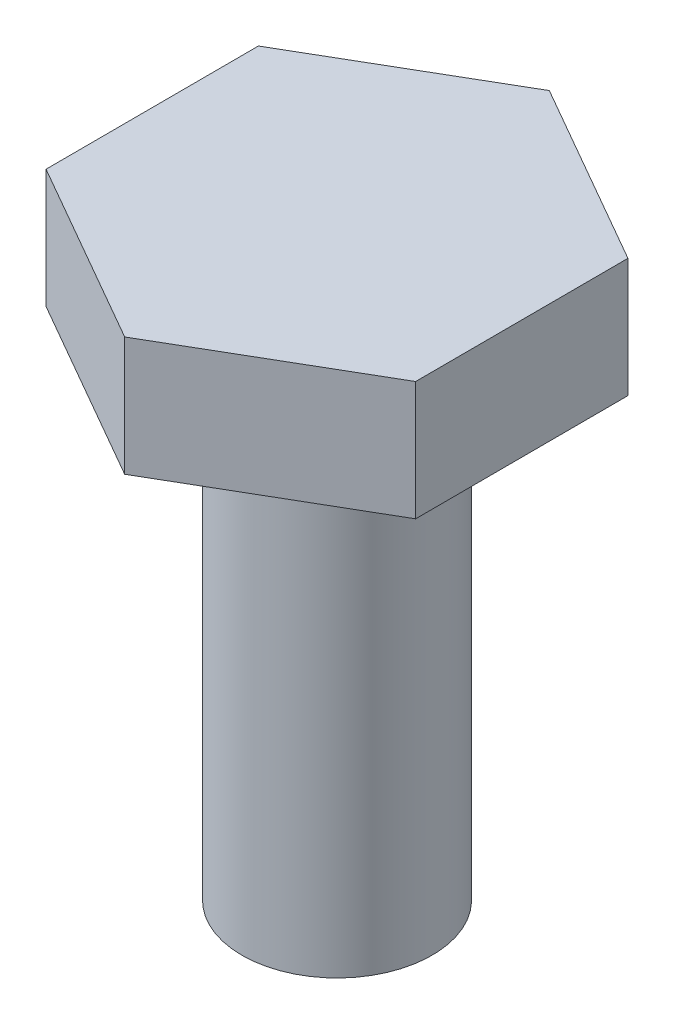
ISO-10303-21;
HEADER;
FILE_DESCRIPTION(('STEP AP214'),'2;1');
FILE_NAME('part.step','',(''),(''),'','','');
FILE_SCHEMA(('AUTOMOTIVE_DESIGN { 1 0 10303 214 1 1 1 1 }'));
ENDSEC;
DATA;
#1=APPLICATION_CONTEXT('core data for automotive mechanical design processes');
#2=APPLICATION_PROTOCOL_DEFINITION('international standard','automotive_design',2000,#1);
#3=PRODUCT_CONTEXT('',#1,'mechanical');
#4=PRODUCT('Part','Part','',(#3));
#5=PRODUCT_RELATED_PRODUCT_CATEGORY('part','',(#4));
#6=PRODUCT_DEFINITION_FORMATION('','',#4);
#7=PRODUCT_DEFINITION_CONTEXT('part definition',#1,'design');
#8=PRODUCT_DEFINITION('design','',#6,#7);
#9=PRODUCT_DEFINITION_SHAPE('','',#8);
#10=(LENGTH_UNIT() NAMED_UNIT(*) SI_UNIT(.MILLI.,.METRE.));
#11=(NAMED_UNIT(*) PLANE_ANGLE_UNIT() SI_UNIT($,.RADIAN.));
#12=(NAMED_UNIT(*) SI_UNIT($,.STERADIAN.) SOLID_ANGLE_UNIT());
#13=UNCERTAINTY_MEASURE_WITH_UNIT(LENGTH_MEASURE(1.E-05),#10,'distance_accuracy_value','');
#14=(GEOMETRIC_REPRESENTATION_CONTEXT(3) GLOBAL_UNCERTAINTY_ASSIGNED_CONTEXT((#13)) GLOBAL_UNIT_ASSIGNED_CONTEXT((#10,
#11,#12)) REPRESENTATION_CONTEXT('',''));
#15=CARTESIAN_POINT('',(0.,0.,0.));
#16=DIRECTION('',(0.,0.,1.));
#17=DIRECTION('',(1.,0.,0.));
#18=AXIS2_PLACEMENT_3D('',#15,#16,#17);
#19=CARTESIAN_POINT('',(0.,4.,0.));
#20=DIRECTION('',(0.,-1.,0.));
#21=DIRECTION('',(0.,0.,-1.));
#22=AXIS2_PLACEMENT_3D('',#19,#20,#21);
#23=CYLINDRICAL_SURFACE('',#22,0.8);
#24=CARTESIAN_POINT('',(0.,4.,0.));
#25=DIRECTION('',(0.,1.,0.));
#26=DIRECTION('',(0.,0.,1.));
#27=AXIS2_PLACEMENT_3D('',#24,#25,#26);
#28=CIRCLE('',#27,0.8);
#29=CARTESIAN_POINT('',(0.,4.,0.8));
#30=VERTEX_POINT('',#29);
#31=EDGE_CURVE('E11',#30,#30,#28,.T.);
#32=ORIENTED_EDGE('',*,*,#31,.F.);
#33=EDGE_LOOP('',(#32));
#34=FACE_BOUND('',#33,.T.);
#35=CARTESIAN_POINT('',(0.,0.,0.));
#36=DIRECTION('',(0.,1.,0.));
#37=DIRECTION('',(0.,0.,1.));
#38=AXIS2_PLACEMENT_3D('',#35,#36,#37);
#39=CIRCLE('',#38,0.8);
#40=CARTESIAN_POINT('',(0.,0.,0.8));
#41=VERTEX_POINT('',#40);
#42=EDGE_CURVE('E37',#41,#41,#39,.T.);
#43=ORIENTED_EDGE('',*,*,#42,.T.);
#44=EDGE_LOOP('',(#43));
#45=FACE_BOUND('',#44,.T.);
#46=ADVANCED_FACE('F34',(#34,#45),#23,.T.);
#47=CARTESIAN_POINT('',(0.,0.,0.));
#48=DIRECTION('',(0.,1.,0.));
#49=DIRECTION('',(0.,0.,1.));
#50=AXIS2_PLACEMENT_3D('',#47,#48,#49);
#51=PLANE('',#50);
#52=ORIENTED_EDGE('',*,*,#42,.F.);
#53=EDGE_LOOP('',(#52));
#54=FACE_BOUND('',#53,.T.);
#55=ADVANCED_FACE('F142',(#54),#51,.F.);
#56=CARTESIAN_POINT('',(1.54774323390104,5.,-0.898790417865524));
#57=DIRECTION('',(-0.497819198807092,0.,0.867280834158731));
#58=DIRECTION('',(0.867280834158731,0.,0.497819198807092));
#59=AXIS2_PLACEMENT_3D('',#56,#57,#58);
#60=PLANE('',#59);
#61=DIRECTION('',(-0.867280834158731,0.,-0.497819198807092));
#62=VECTOR('',#61,1.);
#63=CARTESIAN_POINT('',(1.54774323390104,4.,-0.898790417865524));
#64=LINE('',#63,#62);
#65=CARTESIAN_POINT('',(1.54774323390104,4.,-0.898790417865524));
#66=VERTEX_POINT('',#65);
#67=CARTESIAN_POINT('',(-0.00450371759905472,4.,-1.78978016802654));
#68=VERTEX_POINT('',#67);
#69=EDGE_CURVE('E119',#66,#68,#64,.T.);
#70=ORIENTED_EDGE('',*,*,#69,.T.);
#71=DIRECTION('',(0.,-1.,0.));
#72=VECTOR('',#71,1.);
#73=CARTESIAN_POINT('',(-0.00450371759905472,5.,-1.78978016802654));
#74=LINE('',#73,#72);
#75=CARTESIAN_POINT('',(-0.00450371759905472,5.,-1.78978016802654));
#76=VERTEX_POINT('',#75);
#77=EDGE_CURVE('E136',#76,#68,#74,.T.);
#78=ORIENTED_EDGE('',*,*,#77,.F.);
#79=DIRECTION('',(-0.867280834158731,0.,-0.497819198807092));
#80=VECTOR('',#79,1.);
#81=CARTESIAN_POINT('',(1.54774323390104,5.,-0.898790417865524));
#82=LINE('',#81,#80);
#83=CARTESIAN_POINT('',(1.54774323390104,5.,-0.898790417865524));
#84=VERTEX_POINT('',#83);
#85=EDGE_CURVE('E129',#84,#76,#82,.T.);
#86=ORIENTED_EDGE('',*,*,#85,.F.);
#87=DIRECTION('',(0.,-1.,0.));
#88=VECTOR('',#87,1.);
#89=CARTESIAN_POINT('',(1.54774323390104,5.,-0.898790417865524));
#90=LINE('',#89,#88);
#91=EDGE_CURVE('E115',#84,#66,#90,.T.);
#92=ORIENTED_EDGE('',*,*,#91,.T.);
#93=EDGE_LOOP('',(#70,#78,#86,#92));
#94=FACE_BOUND('',#93,.T.);
#95=ADVANCED_FACE('F144',(#94),#60,.F.);
#96=CARTESIAN_POINT('',(-0.00450371759905472,5.,-1.78978016802654));
#97=DIRECTION('',(0.502177635193274,0.,0.864764489737923));
#98=DIRECTION('',(0.864764489737923,0.,-0.502177635193274));
#99=AXIS2_PLACEMENT_3D('',#96,#97,#98);
#100=PLANE('',#99);
#101=DIRECTION('',(-0.864764489737923,0.,0.502177635193274));
#102=VECTOR('',#101,1.);
#103=CARTESIAN_POINT('',(-0.00450371759905472,4.,-1.78978016802654));
#104=LINE('',#103,#102);
#105=CARTESIAN_POINT('',(-1.55224695150009,4.,-0.890989750161019));
#106=VERTEX_POINT('',#105);
#107=EDGE_CURVE('E122',#68,#106,#104,.T.);
#108=ORIENTED_EDGE('',*,*,#107,.T.);
#109=DIRECTION('',(0.,-1.,0.));
#110=VECTOR('',#109,1.);
#111=CARTESIAN_POINT('',(-1.55224695150009,5.,-0.890989750161019));
#112=LINE('',#111,#110);
#113=CARTESIAN_POINT('',(-1.55224695150009,5.,-0.890989750161019));
#114=VERTEX_POINT('',#113);
#115=EDGE_CURVE('E133',#114,#106,#112,.T.);
#116=ORIENTED_EDGE('',*,*,#115,.F.);
#117=DIRECTION('',(-0.864764489737923,0.,0.502177635193274));
#118=VECTOR('',#117,1.);
#119=CARTESIAN_POINT('',(-0.00450371759905472,5.,-1.78978016802654));
#120=LINE('',#119,#118);
#121=EDGE_CURVE('E88',#76,#114,#120,.T.);
#122=ORIENTED_EDGE('',*,*,#121,.F.);
#123=ORIENTED_EDGE('',*,*,#77,.T.);
#124=EDGE_LOOP('',(#108,#116,#122,#123));
#125=FACE_BOUND('',#124,.T.);
#126=ADVANCED_FACE('F149',(#125),#100,.F.);
#127=CARTESIAN_POINT('',(-1.55224695150009,5.,-0.890989750161019));
#128=DIRECTION('',(0.999996834000366,0.,-0.00251634442080803));
#129=DIRECTION('',(-0.00251634442080803,0.,-0.999996834000366));
#130=AXIS2_PLACEMENT_3D('',#127,#128,#129);
#131=PLANE('',#130);
#132=DIRECTION('',(0.00251634442080803,0.,0.999996834000366));
#133=VECTOR('',#132,1.);
#134=CARTESIAN_POINT('',(-1.55224695150009,4.,-0.890989750161019));
#135=LINE('',#134,#133);
#136=CARTESIAN_POINT('',(-1.54774323390104,4.,0.898790417865524));
#137=VERTEX_POINT('',#136);
#138=EDGE_CURVE('E124',#106,#137,#135,.T.);
#139=ORIENTED_EDGE('',*,*,#138,.T.);
#140=DIRECTION('',(0.,-1.,0.));
#141=VECTOR('',#140,1.);
#142=CARTESIAN_POINT('',(-1.54774323390104,5.,0.898790417865524));
#143=LINE('',#142,#141);
#144=CARTESIAN_POINT('',(-1.54774323390104,5.,0.898790417865524));
#145=VERTEX_POINT('',#144);
#146=EDGE_CURVE('E110',#145,#137,#143,.T.);
#147=ORIENTED_EDGE('',*,*,#146,.F.);
#148=DIRECTION('',(0.00251634442080803,0.,0.999996834000366));
#149=VECTOR('',#148,1.);
#150=CARTESIAN_POINT('',(-1.55224695150009,5.,-0.890989750161019));
#151=LINE('',#150,#149);
#152=EDGE_CURVE('E101',#114,#145,#151,.T.);
#153=ORIENTED_EDGE('',*,*,#152,.F.);
#154=ORIENTED_EDGE('',*,*,#115,.T.);
#155=EDGE_LOOP('',(#139,#147,#153,#154));
#156=FACE_BOUND('',#155,.T.);
#157=ADVANCED_FACE('F156',(#156),#131,.F.);
#158=CARTESIAN_POINT('',(-1.54774323390104,5.,0.898790417865524));
#159=DIRECTION('',(0.497819198807092,0.,-0.867280834158731));
#160=DIRECTION('',(-0.867280834158731,0.,-0.497819198807092));
#161=AXIS2_PLACEMENT_3D('',#158,#159,#160);
#162=PLANE('',#161);
#163=DIRECTION('',(0.867280834158731,0.,0.497819198807092));
#164=VECTOR('',#163,1.);
#165=CARTESIAN_POINT('',(-1.54774323390104,4.,0.898790417865524));
#166=LINE('',#165,#164);
#167=CARTESIAN_POINT('',(0.00450371759905472,4.,1.78978016802654));
#168=VERTEX_POINT('',#167);
#169=EDGE_CURVE('E109',#137,#168,#166,.T.);
#170=ORIENTED_EDGE('',*,*,#169,.T.);
#171=DIRECTION('',(0.,-1.,0.));
#172=VECTOR('',#171,1.);
#173=CARTESIAN_POINT('',(0.00450371759905472,5.,1.78978016802654));
#174=LINE('',#173,#172);
#175=CARTESIAN_POINT('',(0.00450371759905472,5.,1.78978016802654));
#176=VERTEX_POINT('',#175);
#177=EDGE_CURVE('E106',#176,#168,#174,.T.);
#178=ORIENTED_EDGE('',*,*,#177,.F.);
#179=DIRECTION('',(0.867280834158731,0.,0.497819198807092));
#180=VECTOR('',#179,1.);
#181=CARTESIAN_POINT('',(-1.54774323390104,5.,0.898790417865524));
#182=LINE('',#181,#180);
#183=EDGE_CURVE('E95',#145,#176,#182,.T.);
#184=ORIENTED_EDGE('',*,*,#183,.F.);
#185=ORIENTED_EDGE('',*,*,#146,.T.);
#186=EDGE_LOOP('',(#170,#178,#184,#185));
#187=FACE_BOUND('',#186,.T.);
#188=ADVANCED_FACE('F107',(#187),#162,.F.);
#189=CARTESIAN_POINT('',(0.00450371759905472,5.,1.78978016802654));
#190=DIRECTION('',(-0.502177635193274,0.,-0.864764489737923));
#191=DIRECTION('',(-0.864764489737923,0.,0.502177635193274));
#192=AXIS2_PLACEMENT_3D('',#189,#190,#191);
#193=PLANE('',#192);
#194=DIRECTION('',(0.864764489737923,0.,-0.502177635193274));
#195=VECTOR('',#194,1.);
#196=CARTESIAN_POINT('',(0.00450371759905472,4.,1.78978016802654));
#197=LINE('',#196,#195);
#198=CARTESIAN_POINT('',(1.55224695150009,4.,0.890989750161019));
#199=VERTEX_POINT('',#198);
#200=EDGE_CURVE('E73',#168,#199,#197,.T.);
#201=ORIENTED_EDGE('',*,*,#200,.T.);
#202=DIRECTION('',(0.,-1.,0.));
#203=VECTOR('',#202,1.);
#204=CARTESIAN_POINT('',(1.55224695150009,5.,0.890989750161019));
#205=LINE('',#204,#203);
#206=CARTESIAN_POINT('',(1.55224695150009,5.,0.890989750161019));
#207=VERTEX_POINT('',#206);
#208=EDGE_CURVE('E111',#207,#199,#205,.T.);
#209=ORIENTED_EDGE('',*,*,#208,.F.);
#210=DIRECTION('',(0.864764489737923,0.,-0.502177635193274));
#211=VECTOR('',#210,1.);
#212=CARTESIAN_POINT('',(0.00450371759905472,5.,1.78978016802654));
#213=LINE('',#212,#211);
#214=EDGE_CURVE('E99',#176,#207,#213,.T.);
#215=ORIENTED_EDGE('',*,*,#214,.F.);
#216=ORIENTED_EDGE('',*,*,#177,.T.);
#217=EDGE_LOOP('',(#201,#209,#215,#216));
#218=FACE_BOUND('',#217,.T.);
#219=ADVANCED_FACE('F113',(#218),#193,.F.);
#220=CARTESIAN_POINT('',(1.55224695150009,5.,0.890989750161019));
#221=DIRECTION('',(-0.999996834000366,0.,0.00251634442080815));
#222=DIRECTION('',(0.00251634442080815,0.,0.999996834000366));
#223=AXIS2_PLACEMENT_3D('',#220,#221,#222);
#224=PLANE('',#223);
#225=DIRECTION('',(-0.00251634442080815,0.,-0.999996834000366));
#226=VECTOR('',#225,1.);
#227=CARTESIAN_POINT('',(1.55224695150009,4.,0.890989750161019));
#228=LINE('',#227,#226);
#229=EDGE_CURVE('E79',#199,#66,#228,.T.);
#230=ORIENTED_EDGE('',*,*,#229,.T.);
#231=ORIENTED_EDGE('',*,*,#91,.F.);
#232=DIRECTION('',(-0.00251634442080815,0.,-0.999996834000366));
#233=VECTOR('',#232,1.);
#234=CARTESIAN_POINT('',(1.55224695150009,5.,0.890989750161019));
#235=LINE('',#234,#233);
#236=EDGE_CURVE('E50',#207,#84,#235,.T.);
#237=ORIENTED_EDGE('',*,*,#236,.F.);
#238=ORIENTED_EDGE('',*,*,#208,.T.);
#239=EDGE_LOOP('',(#230,#231,#237,#238));
#240=FACE_BOUND('',#239,.T.);
#241=ADVANCED_FACE('F164',(#240),#224,.F.);
#242=CARTESIAN_POINT('',(0.,5.,0.));
#243=DIRECTION('',(0.,1.,0.));
#244=DIRECTION('',(0.,0.,1.));
#245=AXIS2_PLACEMENT_3D('',#242,#243,#244);
#246=PLANE('',#245);
#247=ORIENTED_EDGE('',*,*,#85,.T.);
#248=ORIENTED_EDGE('',*,*,#121,.T.);
#249=ORIENTED_EDGE('',*,*,#152,.T.);
#250=ORIENTED_EDGE('',*,*,#183,.T.);
#251=ORIENTED_EDGE('',*,*,#214,.T.);
#252=ORIENTED_EDGE('',*,*,#236,.T.);
#253=EDGE_LOOP('',(#247,#248,#249,#250,#251,#252));
#254=FACE_BOUND('',#253,.T.);
#255=ADVANCED_FACE('F97',(#254),#246,.T.);
#256=CARTESIAN_POINT('',(0.,4.,0.));
#257=DIRECTION('',(0.,1.,0.));
#258=DIRECTION('',(0.,0.,1.));
#259=AXIS2_PLACEMENT_3D('',#256,#257,#258);
#260=PLANE('',#259);
#261=ORIENTED_EDGE('',*,*,#31,.T.);
#262=EDGE_LOOP('',(#261));
#263=FACE_BOUND('',#262,.T.);
#264=ORIENTED_EDGE('',*,*,#69,.F.);
#265=ORIENTED_EDGE('',*,*,#229,.F.);
#266=ORIENTED_EDGE('',*,*,#200,.F.);
#267=ORIENTED_EDGE('',*,*,#169,.F.);
#268=ORIENTED_EDGE('',*,*,#138,.F.);
#269=ORIENTED_EDGE('',*,*,#107,.F.);
#270=EDGE_LOOP('',(#264,#265,#266,#267,#268,#269));
#271=FACE_BOUND('',#270,.T.);
#272=ADVANCED_FACE('F167',(#263,#271),#260,.F.);
#273=CLOSED_SHELL('',(#46,#55,#95,#126,#157,#188,#219,#241,#255,#272));
#274=MANIFOLD_SOLID_BREP('B2',#273);
#275=ADVANCED_BREP_SHAPE_REPRESENTATION('',(#18,#274),#14);
#276=SHAPE_DEFINITION_REPRESENTATION(#9,#275);
ENDSEC;
END-ISO-10303-21;
